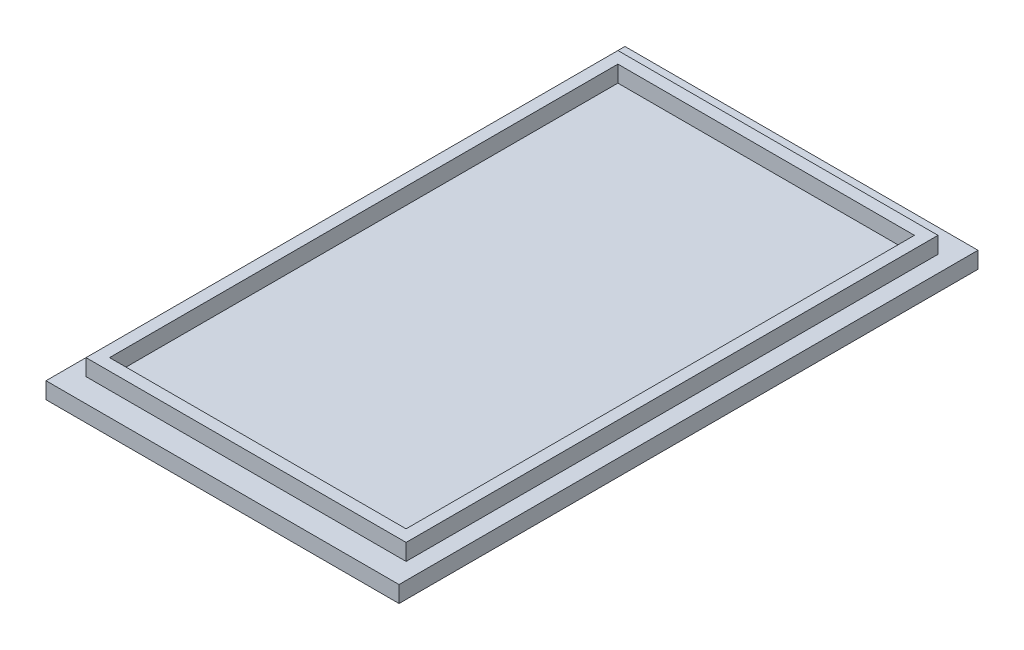
ISO-10303-21;
HEADER;
FILE_DESCRIPTION(('STEP AP214'),'2;1');
FILE_NAME('part.step','',(''),(''),'','','');
FILE_SCHEMA(('AUTOMOTIVE_DESIGN { 1 0 10303 214 1 1 1 1 }'));
ENDSEC;
DATA;
#1=APPLICATION_CONTEXT('core data for automotive mechanical design processes');
#2=APPLICATION_PROTOCOL_DEFINITION('international standard','automotive_design',2000,#1);
#3=PRODUCT_CONTEXT('',#1,'mechanical');
#4=PRODUCT('Part','Part','',(#3));
#5=PRODUCT_RELATED_PRODUCT_CATEGORY('part','',(#4));
#6=PRODUCT_DEFINITION_FORMATION('','',#4);
#7=PRODUCT_DEFINITION_CONTEXT('part definition',#1,'design');
#8=PRODUCT_DEFINITION('design','',#6,#7);
#9=PRODUCT_DEFINITION_SHAPE('','',#8);
#10=(LENGTH_UNIT() NAMED_UNIT(*) SI_UNIT(.MILLI.,.METRE.));
#11=(NAMED_UNIT(*) PLANE_ANGLE_UNIT() SI_UNIT($,.RADIAN.));
#12=(NAMED_UNIT(*) SI_UNIT($,.STERADIAN.) SOLID_ANGLE_UNIT());
#13=UNCERTAINTY_MEASURE_WITH_UNIT(LENGTH_MEASURE(1.E-05),#10,'distance_accuracy_value','');
#14=(GEOMETRIC_REPRESENTATION_CONTEXT(3) GLOBAL_UNCERTAINTY_ASSIGNED_CONTEXT((#13)) GLOBAL_UNIT_ASSIGNED_CONTEXT((#10,
#11,#12)) REPRESENTATION_CONTEXT('',''));
#15=CARTESIAN_POINT('',(0.,0.,0.));
#16=DIRECTION('',(0.,0.,1.));
#17=DIRECTION('',(1.,0.,0.));
#18=AXIS2_PLACEMENT_3D('',#15,#16,#17);
#19=CARTESIAN_POINT('',(0.,1.75,0.));
#20=DIRECTION('',(0.,-1.,0.));
#21=DIRECTION('',(0.,0.,-1.));
#22=AXIS2_PLACEMENT_3D('',#19,#20,#21);
#23=PLANE('',#22);
#24=DIRECTION('',(0.,0.,1.));
#25=VECTOR('',#24,1.);
#26=CARTESIAN_POINT('',(-175.642564618805,1.75,124.068616843366));
#27=LINE('',#26,#25);
#28=CARTESIAN_POINT('',(-175.642564618805,1.75,62.5686168433657));
#29=VERTEX_POINT('',#28);
#30=CARTESIAN_POINT('',(-175.642564618805,1.75,124.068616843366));
#31=VERTEX_POINT('',#30);
#32=EDGE_CURVE('E193',#29,#31,#27,.T.);
#33=ORIENTED_EDGE('',*,*,#32,.T.);
#34=DIRECTION('',(1.,0.,0.));
#35=VECTOR('',#34,1.);
#36=CARTESIAN_POINT('',(-175.642564618805,1.75,124.068616843366));
#37=LINE('',#36,#35);
#38=CARTESIAN_POINT('',(-138.142564618805,1.75,124.068616843366));
#39=VERTEX_POINT('',#38);
#40=EDGE_CURVE('E196',#31,#39,#37,.T.);
#41=ORIENTED_EDGE('',*,*,#40,.T.);
#42=DIRECTION('',(0.,0.,-1.));
#43=VECTOR('',#42,1.);
#44=CARTESIAN_POINT('',(-138.142564618805,1.75,124.068616843366));
#45=LINE('',#44,#43);
#46=CARTESIAN_POINT('',(-138.142564618805,1.75,62.5686168433657));
#47=VERTEX_POINT('',#46);
#48=EDGE_CURVE('E199',#39,#47,#45,.T.);
#49=ORIENTED_EDGE('',*,*,#48,.T.);
#50=DIRECTION('',(-1.,0.,0.));
#51=VECTOR('',#50,1.);
#52=CARTESIAN_POINT('',(-175.642564618805,1.75,62.5686168433657));
#53=LINE('',#52,#51);
#54=EDGE_CURVE('E201',#47,#29,#53,.T.);
#55=ORIENTED_EDGE('',*,*,#54,.T.);
#56=EDGE_LOOP('',(#33,#41,#49,#55));
#57=FACE_BOUND('',#56,.T.);
#58=DIRECTION('',(0.,0.,1.));
#59=VECTOR('',#58,1.);
#60=CARTESIAN_POINT('',(-173.892564618805,1.75,121.568616843366));
#61=LINE('',#60,#59);
#62=CARTESIAN_POINT('',(-173.892564618805,1.75,65.0686168433657));
#63=VERTEX_POINT('',#62);
#64=CARTESIAN_POINT('',(-173.892564618805,1.75,121.568616843366));
#65=VERTEX_POINT('',#64);
#66=EDGE_CURVE('E58',#63,#65,#61,.T.);
#67=ORIENTED_EDGE('',*,*,#66,.F.);
#68=DIRECTION('',(-1.,0.,0.));
#69=VECTOR('',#68,1.);
#70=CARTESIAN_POINT('',(-173.892564618805,1.75,65.0686168433657));
#71=LINE('',#70,#69);
#72=CARTESIAN_POINT('',(-139.892564618805,1.75,65.0686168433657));
#73=VERTEX_POINT('',#72);
#74=EDGE_CURVE('E166',#73,#63,#71,.T.);
#75=ORIENTED_EDGE('',*,*,#74,.F.);
#76=DIRECTION('',(0.,0.,-1.));
#77=VECTOR('',#76,1.);
#78=CARTESIAN_POINT('',(-139.892564618805,1.75,121.568616843366));
#79=LINE('',#78,#77);
#80=CARTESIAN_POINT('',(-139.892564618805,1.75,121.568616843366));
#81=VERTEX_POINT('',#80);
#82=EDGE_CURVE('E177',#81,#73,#79,.T.);
#83=ORIENTED_EDGE('',*,*,#82,.F.);
#84=DIRECTION('',(1.,0.,0.));
#85=VECTOR('',#84,1.);
#86=CARTESIAN_POINT('',(-173.892564618805,1.75,121.568616843366));
#87=LINE('',#86,#85);
#88=EDGE_CURVE('E174',#65,#81,#87,.T.);
#89=ORIENTED_EDGE('',*,*,#88,.F.);
#90=EDGE_LOOP('',(#67,#75,#83,#89));
#91=FACE_BOUND('',#90,.T.);
#92=ADVANCED_FACE('F35',(#57,#91),#23,.F.);
#93=CARTESIAN_POINT('',(-175.642564618805,1.75,124.068616843366));
#94=DIRECTION('',(1.,0.,0.));
#95=DIRECTION('',(0.,0.,-1.));
#96=AXIS2_PLACEMENT_3D('',#93,#94,#95);
#97=PLANE('',#96);
#98=DIRECTION('',(0.,0.,1.));
#99=VECTOR('',#98,1.);
#100=CARTESIAN_POINT('',(-175.642564618805,0.,124.068616843366));
#101=LINE('',#100,#99);
#102=CARTESIAN_POINT('',(-175.642564618805,0.,62.5686168433657));
#103=VERTEX_POINT('',#102);
#104=CARTESIAN_POINT('',(-175.642564618805,0.,124.068616843366));
#105=VERTEX_POINT('',#104);
#106=EDGE_CURVE('E192',#103,#105,#101,.T.);
#107=ORIENTED_EDGE('',*,*,#106,.T.);
#108=DIRECTION('',(0.,-1.,0.));
#109=VECTOR('',#108,1.);
#110=CARTESIAN_POINT('',(-175.642564618805,1.75,124.068616843366));
#111=LINE('',#110,#109);
#112=EDGE_CURVE('E11',#31,#105,#111,.T.);
#113=ORIENTED_EDGE('',*,*,#112,.F.);
#114=ORIENTED_EDGE('',*,*,#32,.F.);
#115=DIRECTION('',(0.,-1.,0.));
#116=VECTOR('',#115,1.);
#117=CARTESIAN_POINT('',(-175.642564618805,1.75,62.5686168433657));
#118=LINE('',#117,#116);
#119=EDGE_CURVE('E203',#29,#103,#118,.T.);
#120=ORIENTED_EDGE('',*,*,#119,.T.);
#121=EDGE_LOOP('',(#107,#113,#114,#120));
#122=FACE_BOUND('',#121,.T.);
#123=ADVANCED_FACE('F37',(#122),#97,.F.);
#124=CARTESIAN_POINT('',(-175.642564618805,1.75,124.068616843366));
#125=DIRECTION('',(0.,0.,-1.));
#126=DIRECTION('',(-1.,0.,0.));
#127=AXIS2_PLACEMENT_3D('',#124,#125,#126);
#128=PLANE('',#127);
#129=DIRECTION('',(1.,0.,0.));
#130=VECTOR('',#129,1.);
#131=CARTESIAN_POINT('',(-175.642564618805,0.,124.068616843366));
#132=LINE('',#131,#130);
#133=CARTESIAN_POINT('',(-138.142564618805,0.,124.068616843366));
#134=VERTEX_POINT('',#133);
#135=EDGE_CURVE('E206',#105,#134,#132,.T.);
#136=ORIENTED_EDGE('',*,*,#135,.T.);
#137=DIRECTION('',(0.,-1.,0.));
#138=VECTOR('',#137,1.);
#139=CARTESIAN_POINT('',(-138.142564618805,1.75,124.068616843366));
#140=LINE('',#139,#138);
#141=EDGE_CURVE('E43',#39,#134,#140,.T.);
#142=ORIENTED_EDGE('',*,*,#141,.F.);
#143=ORIENTED_EDGE('',*,*,#40,.F.);
#144=ORIENTED_EDGE('',*,*,#112,.T.);
#145=EDGE_LOOP('',(#136,#142,#143,#144));
#146=FACE_BOUND('',#145,.T.);
#147=ADVANCED_FACE('F235',(#146),#128,.F.);
#148=CARTESIAN_POINT('',(-138.142564618805,1.75,124.068616843366));
#149=DIRECTION('',(-1.,0.,0.));
#150=DIRECTION('',(0.,0.,1.));
#151=AXIS2_PLACEMENT_3D('',#148,#149,#150);
#152=PLANE('',#151);
#153=DIRECTION('',(0.,0.,-1.));
#154=VECTOR('',#153,1.);
#155=CARTESIAN_POINT('',(-138.142564618805,0.,124.068616843366));
#156=LINE('',#155,#154);
#157=CARTESIAN_POINT('',(-138.142564618805,0.,62.5686168433657));
#158=VERTEX_POINT('',#157);
#159=EDGE_CURVE('E208',#134,#158,#156,.T.);
#160=ORIENTED_EDGE('',*,*,#159,.T.);
#161=DIRECTION('',(0.,-1.,0.));
#162=VECTOR('',#161,1.);
#163=CARTESIAN_POINT('',(-138.142564618805,1.75,62.5686168433657));
#164=LINE('',#163,#162);
#165=EDGE_CURVE('E213',#47,#158,#164,.T.);
#166=ORIENTED_EDGE('',*,*,#165,.F.);
#167=ORIENTED_EDGE('',*,*,#48,.F.);
#168=ORIENTED_EDGE('',*,*,#141,.T.);
#169=EDGE_LOOP('',(#160,#166,#167,#168));
#170=FACE_BOUND('',#169,.T.);
#171=ADVANCED_FACE('F220',(#170),#152,.F.);
#172=CARTESIAN_POINT('',(-175.642564618805,1.75,62.5686168433657));
#173=DIRECTION('',(0.,0.,1.));
#174=DIRECTION('',(1.,0.,0.));
#175=AXIS2_PLACEMENT_3D('',#172,#173,#174);
#176=PLANE('',#175);
#177=DIRECTION('',(-1.,0.,0.));
#178=VECTOR('',#177,1.);
#179=CARTESIAN_POINT('',(-175.642564618805,0.,62.5686168433657));
#180=LINE('',#179,#178);
#181=EDGE_CURVE('E197',#158,#103,#180,.T.);
#182=ORIENTED_EDGE('',*,*,#181,.T.);
#183=ORIENTED_EDGE('',*,*,#119,.F.);
#184=ORIENTED_EDGE('',*,*,#54,.F.);
#185=ORIENTED_EDGE('',*,*,#165,.T.);
#186=EDGE_LOOP('',(#182,#183,#184,#185));
#187=FACE_BOUND('',#186,.T.);
#188=ADVANCED_FACE('F229',(#187),#176,.F.);
#189=CARTESIAN_POINT('',(0.,0.,0.));
#190=DIRECTION('',(0.,-1.,0.));
#191=DIRECTION('',(0.,0.,-1.));
#192=AXIS2_PLACEMENT_3D('',#189,#190,#191);
#193=PLANE('',#192);
#194=ORIENTED_EDGE('',*,*,#106,.F.);
#195=ORIENTED_EDGE('',*,*,#181,.F.);
#196=ORIENTED_EDGE('',*,*,#159,.F.);
#197=ORIENTED_EDGE('',*,*,#135,.F.);
#198=EDGE_LOOP('',(#194,#195,#196,#197));
#199=FACE_BOUND('',#198,.T.);
#200=ADVANCED_FACE('F226',(#199),#193,.T.);
#201=CARTESIAN_POINT('',(-173.892564618805,3.5,121.568616843366));
#202=DIRECTION('',(1.,0.,0.));
#203=DIRECTION('',(0.,0.,-1.));
#204=AXIS2_PLACEMENT_3D('',#201,#202,#203);
#205=PLANE('',#204);
#206=ORIENTED_EDGE('',*,*,#66,.T.);
#207=DIRECTION('',(0.,-1.,0.));
#208=VECTOR('',#207,1.);
#209=CARTESIAN_POINT('',(-173.892564618805,3.5,121.568616843366));
#210=LINE('',#209,#208);
#211=CARTESIAN_POINT('',(-173.892564618805,3.5,121.568616843366));
#212=VERTEX_POINT('',#211);
#213=EDGE_CURVE('E189',#212,#65,#210,.T.);
#214=ORIENTED_EDGE('',*,*,#213,.F.);
#215=DIRECTION('',(0.,0.,1.));
#216=VECTOR('',#215,1.);
#217=CARTESIAN_POINT('',(-173.892564618805,3.5,121.568616843366));
#218=LINE('',#217,#216);
#219=CARTESIAN_POINT('',(-173.892564618805,3.5,65.0686168433657));
#220=VERTEX_POINT('',#219);
#221=EDGE_CURVE('E162',#220,#212,#218,.T.);
#222=ORIENTED_EDGE('',*,*,#221,.F.);
#223=DIRECTION('',(0.,-1.,0.));
#224=VECTOR('',#223,1.);
#225=CARTESIAN_POINT('',(-173.892564618805,3.5,65.0686168433657));
#226=LINE('',#225,#224);
#227=EDGE_CURVE('E172',#220,#63,#226,.T.);
#228=ORIENTED_EDGE('',*,*,#227,.T.);
#229=EDGE_LOOP('',(#206,#214,#222,#228));
#230=FACE_BOUND('',#229,.T.);
#231=ADVANCED_FACE('F248',(#230),#205,.F.);
#232=CARTESIAN_POINT('',(-173.892564618805,3.5,121.568616843366));
#233=DIRECTION('',(0.,0.,-1.));
#234=DIRECTION('',(-1.,0.,0.));
#235=AXIS2_PLACEMENT_3D('',#232,#233,#234);
#236=PLANE('',#235);
#237=ORIENTED_EDGE('',*,*,#88,.T.);
#238=DIRECTION('',(0.,-1.,0.));
#239=VECTOR('',#238,1.);
#240=CARTESIAN_POINT('',(-139.892564618805,3.5,121.568616843366));
#241=LINE('',#240,#239);
#242=CARTESIAN_POINT('',(-139.892564618805,3.5,121.568616843366));
#243=VERTEX_POINT('',#242);
#244=EDGE_CURVE('E186',#243,#81,#241,.T.);
#245=ORIENTED_EDGE('',*,*,#244,.F.);
#246=DIRECTION('',(1.,0.,0.));
#247=VECTOR('',#246,1.);
#248=CARTESIAN_POINT('',(-173.892564618805,3.5,121.568616843366));
#249=LINE('',#248,#247);
#250=EDGE_CURVE('E165',#212,#243,#249,.T.);
#251=ORIENTED_EDGE('',*,*,#250,.F.);
#252=ORIENTED_EDGE('',*,*,#213,.T.);
#253=EDGE_LOOP('',(#237,#245,#251,#252));
#254=FACE_BOUND('',#253,.T.);
#255=ADVANCED_FACE('F267',(#254),#236,.F.);
#256=CARTESIAN_POINT('',(-139.892564618805,3.5,121.568616843366));
#257=DIRECTION('',(-1.,0.,0.));
#258=DIRECTION('',(0.,0.,1.));
#259=AXIS2_PLACEMENT_3D('',#256,#257,#258);
#260=PLANE('',#259);
#261=ORIENTED_EDGE('',*,*,#82,.T.);
#262=DIRECTION('',(0.,-1.,0.));
#263=VECTOR('',#262,1.);
#264=CARTESIAN_POINT('',(-139.892564618805,3.5,65.0686168433657));
#265=LINE('',#264,#263);
#266=CARTESIAN_POINT('',(-139.892564618805,3.5,65.0686168433657));
#267=VERTEX_POINT('',#266);
#268=EDGE_CURVE('E183',#267,#73,#265,.T.);
#269=ORIENTED_EDGE('',*,*,#268,.F.);
#270=DIRECTION('',(0.,0.,-1.));
#271=VECTOR('',#270,1.);
#272=CARTESIAN_POINT('',(-139.892564618805,3.5,121.568616843366));
#273=LINE('',#272,#271);
#274=EDGE_CURVE('E168',#243,#267,#273,.T.);
#275=ORIENTED_EDGE('',*,*,#274,.F.);
#276=ORIENTED_EDGE('',*,*,#244,.T.);
#277=EDGE_LOOP('',(#261,#269,#275,#276));
#278=FACE_BOUND('',#277,.T.);
#279=ADVANCED_FACE('F274',(#278),#260,.F.);
#280=CARTESIAN_POINT('',(-173.892564618805,3.5,65.0686168433657));
#281=DIRECTION('',(0.,0.,1.));
#282=DIRECTION('',(1.,0.,0.));
#283=AXIS2_PLACEMENT_3D('',#280,#281,#282);
#284=PLANE('',#283);
#285=ORIENTED_EDGE('',*,*,#74,.T.);
#286=ORIENTED_EDGE('',*,*,#227,.F.);
#287=DIRECTION('',(-1.,0.,0.));
#288=VECTOR('',#287,1.);
#289=CARTESIAN_POINT('',(-173.892564618805,3.5,65.0686168433657));
#290=LINE('',#289,#288);
#291=EDGE_CURVE('E170',#267,#220,#290,.T.);
#292=ORIENTED_EDGE('',*,*,#291,.F.);
#293=ORIENTED_EDGE('',*,*,#268,.T.);
#294=EDGE_LOOP('',(#285,#286,#292,#293));
#295=FACE_BOUND('',#294,.T.);
#296=ADVANCED_FACE('F281',(#295),#284,.F.);
#297=CARTESIAN_POINT('',(0.,3.5,0.));
#298=DIRECTION('',(0.,-1.,0.));
#299=DIRECTION('',(0.,0.,-1.));
#300=AXIS2_PLACEMENT_3D('',#297,#298,#299);
#301=PLANE('',#300);
#302=DIRECTION('',(1.,0.,0.));
#303=VECTOR('',#302,1.);
#304=CARTESIAN_POINT('',(-172.642564618805,3.5,120.318616843366));
#305=LINE('',#304,#303);
#306=CARTESIAN_POINT('',(-172.642564618805,3.5,120.318616843366));
#307=VERTEX_POINT('',#306);
#308=CARTESIAN_POINT('',(-141.142564618805,3.5,120.318616843366));
#309=VERTEX_POINT('',#308);
#310=EDGE_CURVE('E153',#307,#309,#305,.T.);
#311=ORIENTED_EDGE('',*,*,#310,.F.);
#312=DIRECTION('',(0.,0.,1.));
#313=VECTOR('',#312,1.);
#314=CARTESIAN_POINT('',(-172.642564618805,3.5,120.318616843366));
#315=LINE('',#314,#313);
#316=CARTESIAN_POINT('',(-172.642564618805,3.5,66.3186168433657));
#317=VERTEX_POINT('',#316);
#318=EDGE_CURVE('E50',#317,#307,#315,.T.);
#319=ORIENTED_EDGE('',*,*,#318,.F.);
#320=DIRECTION('',(-1.,0.,0.));
#321=VECTOR('',#320,1.);
#322=CARTESIAN_POINT('',(-172.642564618805,3.5,66.3186168433657));
#323=LINE('',#322,#321);
#324=CARTESIAN_POINT('',(-141.142564618805,3.5,66.3186168433657));
#325=VERTEX_POINT('',#324);
#326=EDGE_CURVE('E144',#325,#317,#323,.T.);
#327=ORIENTED_EDGE('',*,*,#326,.F.);
#328=DIRECTION('',(0.,0.,-1.));
#329=VECTOR('',#328,1.);
#330=CARTESIAN_POINT('',(-141.142564618805,3.5,120.318616843366));
#331=LINE('',#330,#329);
#332=EDGE_CURVE('E147',#309,#325,#331,.T.);
#333=ORIENTED_EDGE('',*,*,#332,.F.);
#334=EDGE_LOOP('',(#311,#319,#327,#333));
#335=FACE_BOUND('',#334,.T.);
#336=ORIENTED_EDGE('',*,*,#221,.T.);
#337=ORIENTED_EDGE('',*,*,#250,.T.);
#338=ORIENTED_EDGE('',*,*,#274,.T.);
#339=ORIENTED_EDGE('',*,*,#291,.T.);
#340=EDGE_LOOP('',(#336,#337,#338,#339));
#341=FACE_BOUND('',#340,.T.);
#342=ADVANCED_FACE('F289',(#335,#341),#301,.F.);
#343=CARTESIAN_POINT('',(-172.642564618805,1.75,120.318616843366));
#344=DIRECTION('',(-1.,0.,0.));
#345=DIRECTION('',(0.,0.,1.));
#346=AXIS2_PLACEMENT_3D('',#343,#344,#345);
#347=PLANE('',#346);
#348=ORIENTED_EDGE('',*,*,#318,.T.);
#349=DIRECTION('',(0.,1.,0.));
#350=VECTOR('',#349,1.);
#351=CARTESIAN_POINT('',(-172.642564618805,1.75,120.318616843366));
#352=LINE('',#351,#350);
#353=CARTESIAN_POINT('',(-172.642564618805,1.75,120.318616843366));
#354=VERTEX_POINT('',#353);
#355=EDGE_CURVE('E122',#354,#307,#352,.T.);
#356=ORIENTED_EDGE('',*,*,#355,.F.);
#357=DIRECTION('',(0.,0.,1.));
#358=VECTOR('',#357,1.);
#359=CARTESIAN_POINT('',(-172.642564618805,1.75,120.318616843366));
#360=LINE('',#359,#358);
#361=CARTESIAN_POINT('',(-172.642564618805,1.75,66.3186168433657));
#362=VERTEX_POINT('',#361);
#363=EDGE_CURVE('E126',#362,#354,#360,.T.);
#364=ORIENTED_EDGE('',*,*,#363,.F.);
#365=DIRECTION('',(0.,1.,0.));
#366=VECTOR('',#365,1.);
#367=CARTESIAN_POINT('',(-172.642564618805,1.75,66.3186168433657));
#368=LINE('',#367,#366);
#369=EDGE_CURVE('E157',#362,#317,#368,.T.);
#370=ORIENTED_EDGE('',*,*,#369,.T.);
#371=EDGE_LOOP('',(#348,#356,#364,#370));
#372=FACE_BOUND('',#371,.T.);
#373=ADVANCED_FACE('F124',(#372),#347,.F.);
#374=CARTESIAN_POINT('',(-172.642564618805,1.75,66.3186168433657));
#375=DIRECTION('',(0.,0.,-1.));
#376=DIRECTION('',(-1.,0.,0.));
#377=AXIS2_PLACEMENT_3D('',#374,#375,#376);
#378=PLANE('',#377);
#379=ORIENTED_EDGE('',*,*,#326,.T.);
#380=ORIENTED_EDGE('',*,*,#369,.F.);
#381=DIRECTION('',(-1.,0.,0.));
#382=VECTOR('',#381,1.);
#383=CARTESIAN_POINT('',(-172.642564618805,1.75,66.3186168433657));
#384=LINE('',#383,#382);
#385=CARTESIAN_POINT('',(-141.142564618805,1.75,66.3186168433657));
#386=VERTEX_POINT('',#385);
#387=EDGE_CURVE('E132',#386,#362,#384,.T.);
#388=ORIENTED_EDGE('',*,*,#387,.F.);
#389=DIRECTION('',(0.,1.,0.));
#390=VECTOR('',#389,1.);
#391=CARTESIAN_POINT('',(-141.142564618805,1.75,66.3186168433657));
#392=LINE('',#391,#390);
#393=EDGE_CURVE('E159',#386,#325,#392,.T.);
#394=ORIENTED_EDGE('',*,*,#393,.T.);
#395=EDGE_LOOP('',(#379,#380,#388,#394));
#396=FACE_BOUND('',#395,.T.);
#397=ADVANCED_FACE('F307',(#396),#378,.F.);
#398=CARTESIAN_POINT('',(-141.142564618805,1.75,120.318616843366));
#399=DIRECTION('',(1.,0.,0.));
#400=DIRECTION('',(0.,0.,-1.));
#401=AXIS2_PLACEMENT_3D('',#398,#399,#400);
#402=PLANE('',#401);
#403=ORIENTED_EDGE('',*,*,#332,.T.);
#404=ORIENTED_EDGE('',*,*,#393,.F.);
#405=DIRECTION('',(0.,0.,-1.));
#406=VECTOR('',#405,1.);
#407=CARTESIAN_POINT('',(-141.142564618805,1.75,120.318616843366));
#408=LINE('',#407,#406);
#409=CARTESIAN_POINT('',(-141.142564618805,1.75,120.318616843366));
#410=VERTEX_POINT('',#409);
#411=EDGE_CURVE('E140',#410,#386,#408,.T.);
#412=ORIENTED_EDGE('',*,*,#411,.F.);
#413=DIRECTION('',(0.,1.,0.));
#414=VECTOR('',#413,1.);
#415=CARTESIAN_POINT('',(-141.142564618805,1.75,120.318616843366));
#416=LINE('',#415,#414);
#417=EDGE_CURVE('E131',#410,#309,#416,.T.);
#418=ORIENTED_EDGE('',*,*,#417,.T.);
#419=EDGE_LOOP('',(#403,#404,#412,#418));
#420=FACE_BOUND('',#419,.T.);
#421=ADVANCED_FACE('F313',(#420),#402,.F.);
#422=CARTESIAN_POINT('',(-172.642564618805,1.75,120.318616843366));
#423=DIRECTION('',(0.,0.,1.));
#424=DIRECTION('',(1.,0.,0.));
#425=AXIS2_PLACEMENT_3D('',#422,#423,#424);
#426=PLANE('',#425);
#427=ORIENTED_EDGE('',*,*,#310,.T.);
#428=ORIENTED_EDGE('',*,*,#417,.F.);
#429=DIRECTION('',(1.,0.,0.));
#430=VECTOR('',#429,1.);
#431=CARTESIAN_POINT('',(-172.642564618805,1.75,120.318616843366));
#432=LINE('',#431,#430);
#433=EDGE_CURVE('E135',#354,#410,#432,.T.);
#434=ORIENTED_EDGE('',*,*,#433,.F.);
#435=ORIENTED_EDGE('',*,*,#355,.T.);
#436=EDGE_LOOP('',(#427,#428,#434,#435));
#437=FACE_BOUND('',#436,.T.);
#438=ADVANCED_FACE('F136',(#437),#426,.F.);
#439=CARTESIAN_POINT('',(0.,1.75,0.));
#440=DIRECTION('',(0.,-1.,0.));
#441=DIRECTION('',(0.,0.,-1.));
#442=AXIS2_PLACEMENT_3D('',#439,#440,#441);
#443=PLANE('',#442);
#444=ORIENTED_EDGE('',*,*,#363,.T.);
#445=ORIENTED_EDGE('',*,*,#433,.T.);
#446=ORIENTED_EDGE('',*,*,#411,.T.);
#447=ORIENTED_EDGE('',*,*,#387,.T.);
#448=EDGE_LOOP('',(#444,#445,#446,#447));
#449=FACE_BOUND('',#448,.T.);
#450=ADVANCED_FACE('F142',(#449),#443,.F.);
#451=CLOSED_SHELL('',(#92,#123,#147,#171,#188,#200,#231,#255,#279,#296,#342,#373,#397,#421,#438,#450));
#452=MANIFOLD_SOLID_BREP('B2',#451);
#453=ADVANCED_BREP_SHAPE_REPRESENTATION('',(#18,#452),#14);
#454=SHAPE_DEFINITION_REPRESENTATION(#9,#453);
ENDSEC;
END-ISO-10303-21;
